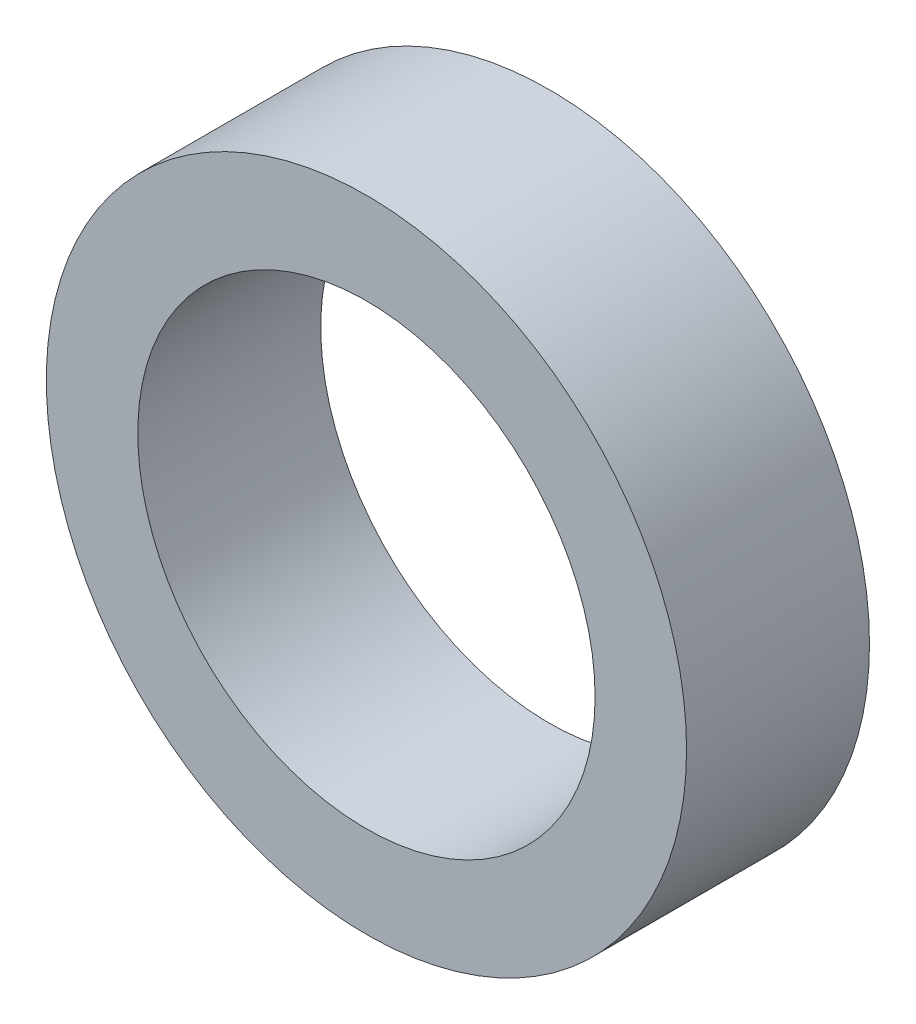
ISO-10303-21;
HEADER;
FILE_DESCRIPTION(('STEP AP214'),'2;1');
FILE_NAME('part.step','',(''),(''),'','','');
FILE_SCHEMA(('AUTOMOTIVE_DESIGN { 1 0 10303 214 1 1 1 1 }'));
ENDSEC;
DATA;
#1=APPLICATION_CONTEXT('core data for automotive mechanical design processes');
#2=APPLICATION_PROTOCOL_DEFINITION('international standard','automotive_design',2000,#1);
#3=PRODUCT_CONTEXT('',#1,'mechanical');
#4=PRODUCT('Part','Part','',(#3));
#5=PRODUCT_RELATED_PRODUCT_CATEGORY('part','',(#4));
#6=PRODUCT_DEFINITION_FORMATION('','',#4);
#7=PRODUCT_DEFINITION_CONTEXT('part definition',#1,'design');
#8=PRODUCT_DEFINITION('design','',#6,#7);
#9=PRODUCT_DEFINITION_SHAPE('','',#8);
#10=(LENGTH_UNIT() NAMED_UNIT(*) SI_UNIT(.MILLI.,.METRE.));
#11=(NAMED_UNIT(*) PLANE_ANGLE_UNIT() SI_UNIT($,.RADIAN.));
#12=(NAMED_UNIT(*) SI_UNIT($,.STERADIAN.) SOLID_ANGLE_UNIT());
#13=UNCERTAINTY_MEASURE_WITH_UNIT(LENGTH_MEASURE(1.E-05),#10,'distance_accuracy_value','');
#14=(GEOMETRIC_REPRESENTATION_CONTEXT(3) GLOBAL_UNCERTAINTY_ASSIGNED_CONTEXT((#13)) GLOBAL_UNIT_ASSIGNED_CONTEXT((#10,
#11,#12)) REPRESENTATION_CONTEXT('',''));
#15=CARTESIAN_POINT('',(0.,0.,0.));
#16=DIRECTION('',(0.,0.,1.));
#17=DIRECTION('',(1.,0.,0.));
#18=AXIS2_PLACEMENT_3D('',#15,#16,#17);
#19=CARTESIAN_POINT('',(0.,0.,25.4));
#20=DIRECTION('',(0.,0.,1.));
#21=DIRECTION('',(1.,0.,0.));
#22=AXIS2_PLACEMENT_3D('',#19,#20,#21);
#23=PLANE('',#22);
#24=CARTESIAN_POINT('',(0.,0.,25.4));
#25=DIRECTION('',(0.,0.,1.));
#26=DIRECTION('',(1.,0.,0.));
#27=AXIS2_PLACEMENT_3D('',#24,#25,#26);
#28=CIRCLE('',#27,88.9);
#29=CARTESIAN_POINT('',(88.9,0.,25.4));
#30=VERTEX_POINT('',#29);
#31=EDGE_CURVE('E10',#30,#30,#28,.T.);
#32=ORIENTED_EDGE('',*,*,#31,.T.);
#33=EDGE_LOOP('',(#32));
#34=FACE_BOUND('',#33,.T.);
#35=CARTESIAN_POINT('',(0.,0.,25.4));
#36=DIRECTION('',(0.,0.,1.));
#37=DIRECTION('',(1.,0.,0.));
#38=AXIS2_PLACEMENT_3D('',#35,#36,#37);
#39=CIRCLE('',#38,63.5);
#40=CARTESIAN_POINT('',(63.5,0.,25.4));
#41=VERTEX_POINT('',#40);
#42=EDGE_CURVE('E41',#41,#41,#39,.T.);
#43=ORIENTED_EDGE('',*,*,#42,.F.);
#44=EDGE_LOOP('',(#43));
#45=FACE_BOUND('',#44,.T.);
#46=ADVANCED_FACE('F30',(#34,#45),#23,.T.);
#47=CARTESIAN_POINT('',(0.,0.,-25.4));
#48=DIRECTION('',(0.,0.,1.));
#49=DIRECTION('',(1.,0.,0.));
#50=AXIS2_PLACEMENT_3D('',#47,#48,#49);
#51=PLANE('',#50);
#52=CARTESIAN_POINT('',(0.,0.,-25.4));
#53=DIRECTION('',(0.,0.,1.));
#54=DIRECTION('',(1.,0.,0.));
#55=AXIS2_PLACEMENT_3D('',#52,#53,#54);
#56=CIRCLE('',#55,88.9);
#57=CARTESIAN_POINT('',(88.9,0.,-25.4));
#58=VERTEX_POINT('',#57);
#59=EDGE_CURVE('E34',#58,#58,#56,.T.);
#60=ORIENTED_EDGE('',*,*,#59,.F.);
#61=EDGE_LOOP('',(#60));
#62=FACE_BOUND('',#61,.T.);
#63=CARTESIAN_POINT('',(0.,0.,-25.4));
#64=DIRECTION('',(0.,0.,1.));
#65=DIRECTION('',(1.,0.,0.));
#66=AXIS2_PLACEMENT_3D('',#63,#64,#65);
#67=CIRCLE('',#66,63.5);
#68=CARTESIAN_POINT('',(63.5,0.,-25.4));
#69=VERTEX_POINT('',#68);
#70=EDGE_CURVE('E43',#69,#69,#67,.T.);
#71=ORIENTED_EDGE('',*,*,#70,.T.);
#72=EDGE_LOOP('',(#71));
#73=FACE_BOUND('',#72,.T.);
#74=ADVANCED_FACE('F53',(#62,#73),#51,.F.);
#75=CARTESIAN_POINT('',(0.,0.,25.4));
#76=DIRECTION('',(0.,0.,-1.));
#77=DIRECTION('',(-1.,0.,0.));
#78=AXIS2_PLACEMENT_3D('',#75,#76,#77);
#79=CYLINDRICAL_SURFACE('',#78,88.9);
#80=ORIENTED_EDGE('',*,*,#31,.F.);
#81=EDGE_LOOP('',(#80));
#82=FACE_BOUND('',#81,.T.);
#83=ORIENTED_EDGE('',*,*,#59,.T.);
#84=EDGE_LOOP('',(#83));
#85=FACE_BOUND('',#84,.T.);
#86=ADVANCED_FACE('F32',(#82,#85),#79,.T.);
#87=CARTESIAN_POINT('',(0.,0.,25.4));
#88=DIRECTION('',(0.,0.,-1.));
#89=DIRECTION('',(-1.,0.,0.));
#90=AXIS2_PLACEMENT_3D('',#87,#88,#89);
#91=CYLINDRICAL_SURFACE('',#90,63.5);
#92=ORIENTED_EDGE('',*,*,#42,.T.);
#93=EDGE_LOOP('',(#92));
#94=FACE_BOUND('',#93,.T.);
#95=ORIENTED_EDGE('',*,*,#70,.F.);
#96=EDGE_LOOP('',(#95));
#97=FACE_BOUND('',#96,.T.);
#98=ADVANCED_FACE('F49',(#94,#97),#91,.F.);
#99=CLOSED_SHELL('',(#46,#74,#86,#98));
#100=MANIFOLD_SOLID_BREP('B2',#99);
#101=ADVANCED_BREP_SHAPE_REPRESENTATION('',(#18,#100),#14);
#102=SHAPE_DEFINITION_REPRESENTATION(#9,#101);
ENDSEC;
END-ISO-10303-21;
